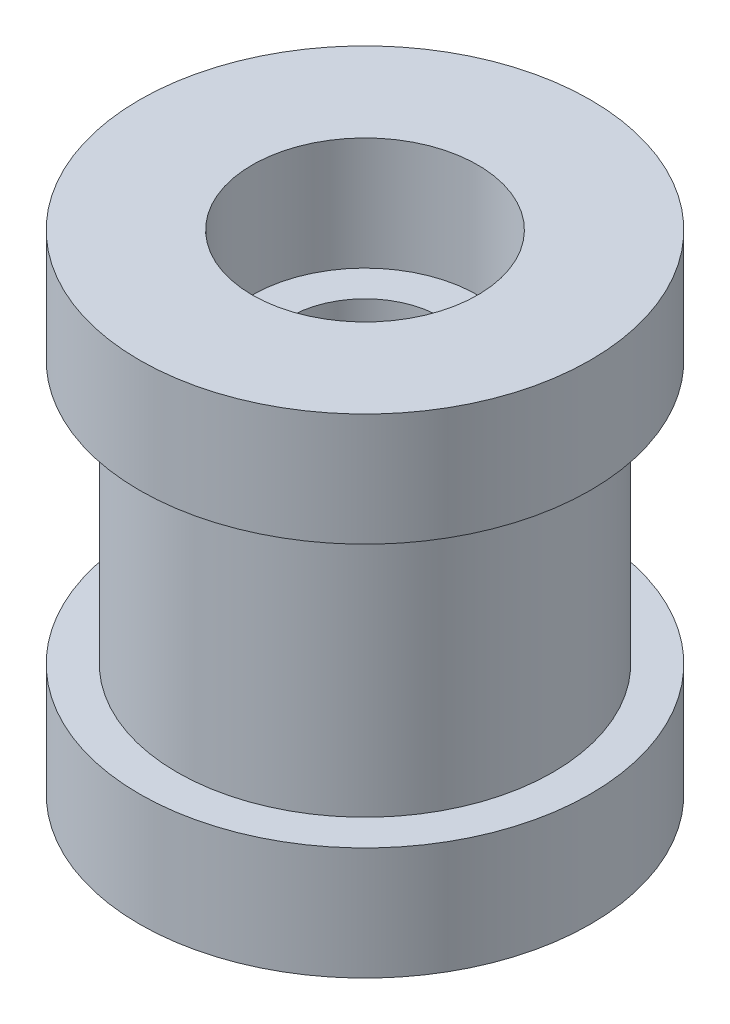
ISO-10303-21;
HEADER;
FILE_DESCRIPTION(('STEP AP214'),'2;1');
FILE_NAME('part.step','',(''),(''),'','','');
FILE_SCHEMA(('AUTOMOTIVE_DESIGN { 1 0 10303 214 1 1 1 1 }'));
ENDSEC;
DATA;
#1=APPLICATION_CONTEXT('core data for automotive mechanical design processes');
#2=APPLICATION_PROTOCOL_DEFINITION('international standard','automotive_design',2000,#1);
#3=PRODUCT_CONTEXT('',#1,'mechanical');
#4=PRODUCT('Part','Part','',(#3));
#5=PRODUCT_RELATED_PRODUCT_CATEGORY('part','',(#4));
#6=PRODUCT_DEFINITION_FORMATION('','',#4);
#7=PRODUCT_DEFINITION_CONTEXT('part definition',#1,'design');
#8=PRODUCT_DEFINITION('design','',#6,#7);
#9=PRODUCT_DEFINITION_SHAPE('','',#8);
#10=(LENGTH_UNIT() NAMED_UNIT(*) SI_UNIT(.MILLI.,.METRE.));
#11=(NAMED_UNIT(*) PLANE_ANGLE_UNIT() SI_UNIT($,.RADIAN.));
#12=(NAMED_UNIT(*) SI_UNIT($,.STERADIAN.) SOLID_ANGLE_UNIT());
#13=UNCERTAINTY_MEASURE_WITH_UNIT(LENGTH_MEASURE(1.E-05),#10,'distance_accuracy_value','');
#14=(GEOMETRIC_REPRESENTATION_CONTEXT(3) GLOBAL_UNCERTAINTY_ASSIGNED_CONTEXT((#13)) GLOBAL_UNIT_ASSIGNED_CONTEXT((#10,
#11,#12)) REPRESENTATION_CONTEXT('',''));
#15=CARTESIAN_POINT('',(0.,0.,0.));
#16=DIRECTION('',(0.,0.,1.));
#17=DIRECTION('',(1.,0.,0.));
#18=AXIS2_PLACEMENT_3D('',#15,#16,#17);
#19=CARTESIAN_POINT('',(0.,78.4867678271938,0.));
#20=DIRECTION('',(0.,1.,0.));
#21=DIRECTION('',(0.,0.,1.));
#22=AXIS2_PLACEMENT_3D('',#19,#20,#21);
#23=CYLINDRICAL_SURFACE('',#22,30.);
#24=CARTESIAN_POINT('',(0.,0.,0.));
#25=DIRECTION('',(0.,1.,0.));
#26=DIRECTION('',(0.,0.,1.));
#27=AXIS2_PLACEMENT_3D('',#24,#25,#26);
#28=CIRCLE('',#27,30.);
#29=CARTESIAN_POINT('',(0.,0.,30.));
#30=VERTEX_POINT('',#29);
#31=EDGE_CURVE('E10',#30,#30,#28,.T.);
#32=ORIENTED_EDGE('',*,*,#31,.F.);
#33=EDGE_LOOP('',(#32));
#34=FACE_BOUND('',#33,.T.);
#35=CARTESIAN_POINT('',(0.,30.,0.));
#36=DIRECTION('',(0.,1.,0.));
#37=DIRECTION('',(0.,0.,1.));
#38=AXIS2_PLACEMENT_3D('',#35,#36,#37);
#39=CIRCLE('',#38,30.);
#40=CARTESIAN_POINT('',(0.,30.,30.));
#41=VERTEX_POINT('',#40);
#42=EDGE_CURVE('E83',#41,#41,#39,.T.);
#43=ORIENTED_EDGE('',*,*,#42,.T.);
#44=EDGE_LOOP('',(#43));
#45=FACE_BOUND('',#44,.T.);
#46=ADVANCED_FACE('F31',(#34,#45),#23,.F.);
#47=CARTESIAN_POINT('',(-30.,0.,0.));
#48=DIRECTION('',(0.,1.,0.));
#49=DIRECTION('',(0.,0.,1.));
#50=AXIS2_PLACEMENT_3D('',#47,#48,#49);
#51=PLANE('',#50);
#52=CARTESIAN_POINT('',(0.,0.,0.));
#53=DIRECTION('',(0.,1.,0.));
#54=DIRECTION('',(0.,0.,1.));
#55=AXIS2_PLACEMENT_3D('',#52,#53,#54);
#56=CIRCLE('',#55,60.);
#57=CARTESIAN_POINT('',(0.,0.,60.));
#58=VERTEX_POINT('',#57);
#59=EDGE_CURVE('E37',#58,#58,#56,.T.);
#60=ORIENTED_EDGE('',*,*,#59,.F.);
#61=EDGE_LOOP('',(#60));
#62=FACE_BOUND('',#61,.T.);
#63=ORIENTED_EDGE('',*,*,#31,.T.);
#64=EDGE_LOOP('',(#63));
#65=FACE_BOUND('',#64,.T.);
#66=ADVANCED_FACE('F168',(#62,#65),#51,.F.);
#67=CARTESIAN_POINT('',(0.,78.4867678271938,0.));
#68=DIRECTION('',(0.,1.,0.));
#69=DIRECTION('',(0.,0.,1.));
#70=AXIS2_PLACEMENT_3D('',#67,#68,#69);
#71=CYLINDRICAL_SURFACE('',#70,60.);
#72=CARTESIAN_POINT('',(0.,30.,0.));
#73=DIRECTION('',(0.,1.,0.));
#74=DIRECTION('',(0.,0.,1.));
#75=AXIS2_PLACEMENT_3D('',#72,#73,#74);
#76=CIRCLE('',#75,60.);
#77=CARTESIAN_POINT('',(0.,30.,60.));
#78=VERTEX_POINT('',#77);
#79=EDGE_CURVE('E41',#78,#78,#76,.T.);
#80=ORIENTED_EDGE('',*,*,#79,.F.);
#81=EDGE_LOOP('',(#80));
#82=FACE_BOUND('',#81,.T.);
#83=ORIENTED_EDGE('',*,*,#59,.T.);
#84=EDGE_LOOP('',(#83));
#85=FACE_BOUND('',#84,.T.);
#86=ADVANCED_FACE('F163',(#82,#85),#71,.T.);
#87=CARTESIAN_POINT('',(-60.,30.,0.));
#88=DIRECTION('',(0.,-1.,0.));
#89=DIRECTION('',(0.,0.,-1.));
#90=AXIS2_PLACEMENT_3D('',#87,#88,#89);
#91=PLANE('',#90);
#92=CARTESIAN_POINT('',(0.,30.,0.));
#93=DIRECTION('',(0.,1.,0.));
#94=DIRECTION('',(0.,0.,1.));
#95=AXIS2_PLACEMENT_3D('',#92,#93,#94);
#96=CIRCLE('',#95,50.);
#97=CARTESIAN_POINT('',(0.,30.,50.));
#98=VERTEX_POINT('',#97);
#99=EDGE_CURVE('E45',#98,#98,#96,.T.);
#100=ORIENTED_EDGE('',*,*,#99,.F.);
#101=EDGE_LOOP('',(#100));
#102=FACE_BOUND('',#101,.T.);
#103=ORIENTED_EDGE('',*,*,#79,.T.);
#104=EDGE_LOOP('',(#103));
#105=FACE_BOUND('',#104,.T.);
#106=ADVANCED_FACE('F157',(#102,#105),#91,.F.);
#107=CARTESIAN_POINT('',(0.,78.4867678271938,0.));
#108=DIRECTION('',(0.,1.,0.));
#109=DIRECTION('',(0.,0.,1.));
#110=AXIS2_PLACEMENT_3D('',#107,#108,#109);
#111=CYLINDRICAL_SURFACE('',#110,50.);
#112=CARTESIAN_POINT('',(0.,100.,0.));
#113=DIRECTION('',(0.,1.,0.));
#114=DIRECTION('',(0.,0.,1.));
#115=AXIS2_PLACEMENT_3D('',#112,#113,#114);
#116=CIRCLE('',#115,50.);
#117=CARTESIAN_POINT('',(0.,100.,50.));
#118=VERTEX_POINT('',#117);
#119=EDGE_CURVE('E50',#118,#118,#116,.T.);
#120=ORIENTED_EDGE('',*,*,#119,.F.);
#121=EDGE_LOOP('',(#120));
#122=FACE_BOUND('',#121,.T.);
#123=ORIENTED_EDGE('',*,*,#99,.T.);
#124=EDGE_LOOP('',(#123));
#125=FACE_BOUND('',#124,.T.);
#126=ADVANCED_FACE('F151',(#122,#125),#111,.T.);
#127=CARTESIAN_POINT('',(-50.,100.,0.));
#128=DIRECTION('',(0.,1.,0.));
#129=DIRECTION('',(0.,0.,1.));
#130=AXIS2_PLACEMENT_3D('',#127,#128,#129);
#131=PLANE('',#130);
#132=CARTESIAN_POINT('',(0.,100.,0.));
#133=DIRECTION('',(0.,1.,0.));
#134=DIRECTION('',(0.,0.,1.));
#135=AXIS2_PLACEMENT_3D('',#132,#133,#134);
#136=CIRCLE('',#135,60.);
#137=CARTESIAN_POINT('',(0.,100.,60.));
#138=VERTEX_POINT('',#137);
#139=EDGE_CURVE('E53',#138,#138,#136,.T.);
#140=ORIENTED_EDGE('',*,*,#139,.F.);
#141=EDGE_LOOP('',(#140));
#142=FACE_BOUND('',#141,.T.);
#143=ORIENTED_EDGE('',*,*,#119,.T.);
#144=EDGE_LOOP('',(#143));
#145=FACE_BOUND('',#144,.T.);
#146=ADVANCED_FACE('F145',(#142,#145),#131,.F.);
#147=CARTESIAN_POINT('',(0.,78.4867678271938,0.));
#148=DIRECTION('',(0.,1.,0.));
#149=DIRECTION('',(0.,0.,1.));
#150=AXIS2_PLACEMENT_3D('',#147,#148,#149);
#151=CYLINDRICAL_SURFACE('',#150,60.);
#152=CARTESIAN_POINT('',(0.,130.,0.));
#153=DIRECTION('',(0.,1.,0.));
#154=DIRECTION('',(0.,0.,1.));
#155=AXIS2_PLACEMENT_3D('',#152,#153,#154);
#156=CIRCLE('',#155,60.);
#157=CARTESIAN_POINT('',(0.,130.,60.));
#158=VERTEX_POINT('',#157);
#159=EDGE_CURVE('E56',#158,#158,#156,.T.);
#160=ORIENTED_EDGE('',*,*,#159,.F.);
#161=EDGE_LOOP('',(#160));
#162=FACE_BOUND('',#161,.T.);
#163=ORIENTED_EDGE('',*,*,#139,.T.);
#164=EDGE_LOOP('',(#163));
#165=FACE_BOUND('',#164,.T.);
#166=ADVANCED_FACE('F139',(#162,#165),#151,.T.);
#167=CARTESIAN_POINT('',(-60.,130.,0.));
#168=DIRECTION('',(0.,-1.,0.));
#169=DIRECTION('',(0.,0.,-1.));
#170=AXIS2_PLACEMENT_3D('',#167,#168,#169);
#171=PLANE('',#170);
#172=CARTESIAN_POINT('',(0.,130.,0.));
#173=DIRECTION('',(0.,1.,0.));
#174=DIRECTION('',(0.,0.,1.));
#175=AXIS2_PLACEMENT_3D('',#172,#173,#174);
#176=CIRCLE('',#175,30.);
#177=CARTESIAN_POINT('',(0.,130.,30.));
#178=VERTEX_POINT('',#177);
#179=EDGE_CURVE('E59',#178,#178,#176,.T.);
#180=ORIENTED_EDGE('',*,*,#179,.F.);
#181=EDGE_LOOP('',(#180));
#182=FACE_BOUND('',#181,.T.);
#183=ORIENTED_EDGE('',*,*,#159,.T.);
#184=EDGE_LOOP('',(#183));
#185=FACE_BOUND('',#184,.T.);
#186=ADVANCED_FACE('F133',(#182,#185),#171,.F.);
#187=CARTESIAN_POINT('',(0.,78.4867678271938,0.));
#188=DIRECTION('',(0.,1.,0.));
#189=DIRECTION('',(0.,0.,1.));
#190=AXIS2_PLACEMENT_3D('',#187,#188,#189);
#191=CYLINDRICAL_SURFACE('',#190,30.);
#192=CARTESIAN_POINT('',(0.,100.,0.));
#193=DIRECTION('',(0.,1.,0.));
#194=DIRECTION('',(0.,0.,1.));
#195=AXIS2_PLACEMENT_3D('',#192,#193,#194);
#196=CIRCLE('',#195,30.);
#197=CARTESIAN_POINT('',(0.,100.,30.));
#198=VERTEX_POINT('',#197);
#199=EDGE_CURVE('E62',#198,#198,#196,.T.);
#200=ORIENTED_EDGE('',*,*,#199,.F.);
#201=EDGE_LOOP('',(#200));
#202=FACE_BOUND('',#201,.T.);
#203=ORIENTED_EDGE('',*,*,#179,.T.);
#204=EDGE_LOOP('',(#203));
#205=FACE_BOUND('',#204,.T.);
#206=ADVANCED_FACE('F127',(#202,#205),#191,.F.);
#207=CARTESIAN_POINT('',(-30.,100.,0.));
#208=DIRECTION('',(0.,-1.,0.));
#209=DIRECTION('',(0.,0.,-1.));
#210=AXIS2_PLACEMENT_3D('',#207,#208,#209);
#211=PLANE('',#210);
#212=CARTESIAN_POINT('',(0.,100.,0.));
#213=DIRECTION('',(0.,1.,0.));
#214=DIRECTION('',(0.,0.,1.));
#215=AXIS2_PLACEMENT_3D('',#212,#213,#214);
#216=CIRCLE('',#215,20.);
#217=CARTESIAN_POINT('',(0.,100.,20.));
#218=VERTEX_POINT('',#217);
#219=EDGE_CURVE('E65',#218,#218,#216,.T.);
#220=ORIENTED_EDGE('',*,*,#219,.F.);
#221=EDGE_LOOP('',(#220));
#222=FACE_BOUND('',#221,.T.);
#223=ORIENTED_EDGE('',*,*,#199,.T.);
#224=EDGE_LOOP('',(#223));
#225=FACE_BOUND('',#224,.T.);
#226=ADVANCED_FACE('F121',(#222,#225),#211,.F.);
#227=CARTESIAN_POINT('',(0.,78.4867678271938,0.));
#228=DIRECTION('',(0.,1.,0.));
#229=DIRECTION('',(0.,0.,1.));
#230=AXIS2_PLACEMENT_3D('',#227,#228,#229);
#231=CYLINDRICAL_SURFACE('',#230,20.);
#232=CARTESIAN_POINT('',(0.,85.,0.));
#233=DIRECTION('',(0.,1.,0.));
#234=DIRECTION('',(0.,0.,1.));
#235=AXIS2_PLACEMENT_3D('',#232,#233,#234);
#236=CIRCLE('',#235,20.);
#237=CARTESIAN_POINT('',(0.,85.,20.));
#238=VERTEX_POINT('',#237);
#239=EDGE_CURVE('E68',#238,#238,#236,.T.);
#240=ORIENTED_EDGE('',*,*,#239,.F.);
#241=EDGE_LOOP('',(#240));
#242=FACE_BOUND('',#241,.T.);
#243=ORIENTED_EDGE('',*,*,#219,.T.);
#244=EDGE_LOOP('',(#243));
#245=FACE_BOUND('',#244,.T.);
#246=ADVANCED_FACE('F115',(#242,#245),#231,.F.);
#247=CARTESIAN_POINT('',(-20.,85.,0.));
#248=DIRECTION('',(0.,1.,0.));
#249=DIRECTION('',(0.,0.,1.));
#250=AXIS2_PLACEMENT_3D('',#247,#248,#249);
#251=PLANE('',#250);
#252=CARTESIAN_POINT('',(0.,85.,0.));
#253=DIRECTION('',(0.,1.,0.));
#254=DIRECTION('',(0.,0.,1.));
#255=AXIS2_PLACEMENT_3D('',#252,#253,#254);
#256=CIRCLE('',#255,35.);
#257=CARTESIAN_POINT('',(0.,85.,35.));
#258=VERTEX_POINT('',#257);
#259=EDGE_CURVE('E71',#258,#258,#256,.T.);
#260=ORIENTED_EDGE('',*,*,#259,.F.);
#261=EDGE_LOOP('',(#260));
#262=FACE_BOUND('',#261,.T.);
#263=ORIENTED_EDGE('',*,*,#239,.T.);
#264=EDGE_LOOP('',(#263));
#265=FACE_BOUND('',#264,.T.);
#266=ADVANCED_FACE('F109',(#262,#265),#251,.F.);
#267=CARTESIAN_POINT('',(0.,78.4867678271938,0.));
#268=DIRECTION('',(0.,1.,0.));
#269=DIRECTION('',(0.,0.,1.));
#270=AXIS2_PLACEMENT_3D('',#267,#268,#269);
#271=CYLINDRICAL_SURFACE('',#270,35.);
#272=CARTESIAN_POINT('',(0.,45.,0.));
#273=DIRECTION('',(0.,1.,0.));
#274=DIRECTION('',(0.,0.,1.));
#275=AXIS2_PLACEMENT_3D('',#272,#273,#274);
#276=CIRCLE('',#275,35.);
#277=CARTESIAN_POINT('',(0.,45.,35.));
#278=VERTEX_POINT('',#277);
#279=EDGE_CURVE('E74',#278,#278,#276,.T.);
#280=ORIENTED_EDGE('',*,*,#279,.F.);
#281=EDGE_LOOP('',(#280));
#282=FACE_BOUND('',#281,.T.);
#283=ORIENTED_EDGE('',*,*,#259,.T.);
#284=EDGE_LOOP('',(#283));
#285=FACE_BOUND('',#284,.T.);
#286=ADVANCED_FACE('F103',(#282,#285),#271,.F.);
#287=CARTESIAN_POINT('',(-35.,45.,0.));
#288=DIRECTION('',(0.,-1.,0.));
#289=DIRECTION('',(0.,0.,-1.));
#290=AXIS2_PLACEMENT_3D('',#287,#288,#289);
#291=PLANE('',#290);
#292=CARTESIAN_POINT('',(0.,45.,0.));
#293=DIRECTION('',(0.,1.,0.));
#294=DIRECTION('',(0.,0.,1.));
#295=AXIS2_PLACEMENT_3D('',#292,#293,#294);
#296=CIRCLE('',#295,20.);
#297=CARTESIAN_POINT('',(0.,45.,20.));
#298=VERTEX_POINT('',#297);
#299=EDGE_CURVE('E77',#298,#298,#296,.T.);
#300=ORIENTED_EDGE('',*,*,#299,.F.);
#301=EDGE_LOOP('',(#300));
#302=FACE_BOUND('',#301,.T.);
#303=ORIENTED_EDGE('',*,*,#279,.T.);
#304=EDGE_LOOP('',(#303));
#305=FACE_BOUND('',#304,.T.);
#306=ADVANCED_FACE('F97',(#302,#305),#291,.F.);
#307=CARTESIAN_POINT('',(0.,78.4867678271938,0.));
#308=DIRECTION('',(0.,1.,0.));
#309=DIRECTION('',(0.,0.,1.));
#310=AXIS2_PLACEMENT_3D('',#307,#308,#309);
#311=CYLINDRICAL_SURFACE('',#310,20.);
#312=CARTESIAN_POINT('',(0.,30.,0.));
#313=DIRECTION('',(0.,1.,0.));
#314=DIRECTION('',(0.,0.,1.));
#315=AXIS2_PLACEMENT_3D('',#312,#313,#314);
#316=CIRCLE('',#315,20.);
#317=CARTESIAN_POINT('',(0.,30.,20.));
#318=VERTEX_POINT('',#317);
#319=EDGE_CURVE('E80',#318,#318,#316,.T.);
#320=ORIENTED_EDGE('',*,*,#319,.F.);
#321=EDGE_LOOP('',(#320));
#322=FACE_BOUND('',#321,.T.);
#323=ORIENTED_EDGE('',*,*,#299,.T.);
#324=EDGE_LOOP('',(#323));
#325=FACE_BOUND('',#324,.T.);
#326=ADVANCED_FACE('F91',(#322,#325),#311,.F.);
#327=CARTESIAN_POINT('',(-20.,30.,0.));
#328=DIRECTION('',(0.,1.,0.));
#329=DIRECTION('',(0.,0.,1.));
#330=AXIS2_PLACEMENT_3D('',#327,#328,#329);
#331=PLANE('',#330);
#332=ORIENTED_EDGE('',*,*,#42,.F.);
#333=EDGE_LOOP('',(#332));
#334=FACE_BOUND('',#333,.T.);
#335=ORIENTED_EDGE('',*,*,#319,.T.);
#336=EDGE_LOOP('',(#335));
#337=FACE_BOUND('',#336,.T.);
#338=ADVANCED_FACE('F88',(#334,#337),#331,.F.);
#339=CLOSED_SHELL('',(#46,#66,#86,#106,#126,#146,#166,#186,#206,#226,#246,#266,#286,#306,#326,#338));
#340=MANIFOLD_SOLID_BREP('B2',#339);
#341=ADVANCED_BREP_SHAPE_REPRESENTATION('',(#18,#340),#14);
#342=SHAPE_DEFINITION_REPRESENTATION(#9,#341);
ENDSEC;
END-ISO-10303-21;
